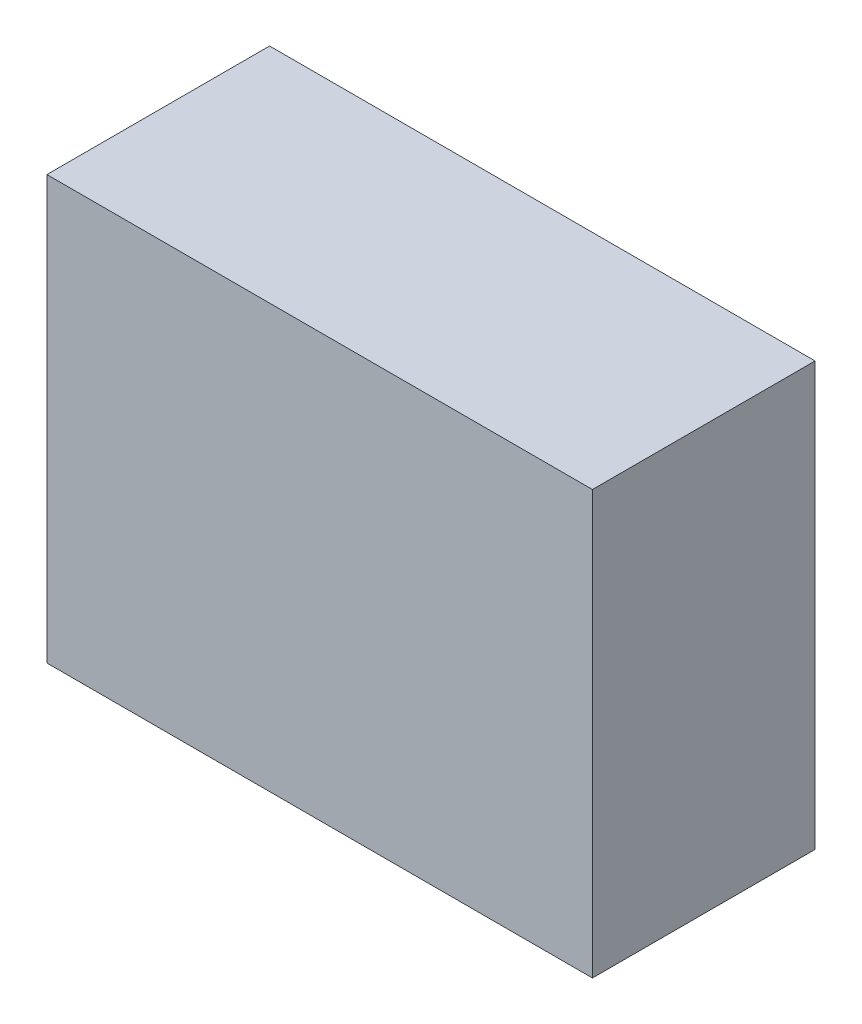
ISO-10303-21;
HEADER;
FILE_DESCRIPTION(('STEP AP214'),'2;1');
FILE_NAME('part.step','',(''),(''),'','','');
FILE_SCHEMA(('AUTOMOTIVE_DESIGN { 1 0 10303 214 1 1 1 1 }'));
ENDSEC;
DATA;
#1=APPLICATION_CONTEXT('core data for automotive mechanical design processes');
#2=APPLICATION_PROTOCOL_DEFINITION('international standard','automotive_design',2000,#1);
#3=PRODUCT_CONTEXT('',#1,'mechanical');
#4=PRODUCT('Part','Part','',(#3));
#5=PRODUCT_RELATED_PRODUCT_CATEGORY('part','',(#4));
#6=PRODUCT_DEFINITION_FORMATION('','',#4);
#7=PRODUCT_DEFINITION_CONTEXT('part definition',#1,'design');
#8=PRODUCT_DEFINITION('design','',#6,#7);
#9=PRODUCT_DEFINITION_SHAPE('','',#8);
#10=(LENGTH_UNIT() NAMED_UNIT(*) SI_UNIT(.MILLI.,.METRE.));
#11=(NAMED_UNIT(*) PLANE_ANGLE_UNIT() SI_UNIT($,.RADIAN.));
#12=(NAMED_UNIT(*) SI_UNIT($,.STERADIAN.) SOLID_ANGLE_UNIT());
#13=UNCERTAINTY_MEASURE_WITH_UNIT(LENGTH_MEASURE(1.E-05),#10,'distance_accuracy_value','');
#14=(GEOMETRIC_REPRESENTATION_CONTEXT(3) GLOBAL_UNCERTAINTY_ASSIGNED_CONTEXT((#13)) GLOBAL_UNIT_ASSIGNED_CONTEXT((#10,
#11,#12)) REPRESENTATION_CONTEXT('',''));
#15=CARTESIAN_POINT('',(0.,0.,0.));
#16=DIRECTION('',(0.,0.,1.));
#17=DIRECTION('',(1.,0.,0.));
#18=AXIS2_PLACEMENT_3D('',#15,#16,#17);
#19=CARTESIAN_POINT('',(-49.,38.,40.));
#20=DIRECTION('',(0.,-1.,0.));
#21=DIRECTION('',(1.,0.,0.));
#22=AXIS2_PLACEMENT_3D('',#19,#20,#21);
#23=PLANE('',#22);
#24=DIRECTION('',(-1.,0.,0.));
#25=VECTOR('',#24,1.);
#26=CARTESIAN_POINT('',(-49.,38.,0.));
#27=LINE('',#26,#25);
#28=CARTESIAN_POINT('',(49.,38.,0.));
#29=VERTEX_POINT('',#28);
#30=CARTESIAN_POINT('',(-49.,38.,0.));
#31=VERTEX_POINT('',#30);
#32=EDGE_CURVE('E105',#29,#31,#27,.T.);
#33=ORIENTED_EDGE('',*,*,#32,.T.);
#34=DIRECTION('',(0.,0.,-1.));
#35=VECTOR('',#34,1.);
#36=CARTESIAN_POINT('',(-49.,38.,40.));
#37=LINE('',#36,#35);
#38=CARTESIAN_POINT('',(-49.,38.,40.));
#39=VERTEX_POINT('',#38);
#40=EDGE_CURVE('E11',#39,#31,#37,.T.);
#41=ORIENTED_EDGE('',*,*,#40,.F.);
#42=DIRECTION('',(-1.,0.,0.));
#43=VECTOR('',#42,1.);
#44=CARTESIAN_POINT('',(-49.,38.,40.));
#45=LINE('',#44,#43);
#46=CARTESIAN_POINT('',(49.,38.,40.));
#47=VERTEX_POINT('',#46);
#48=EDGE_CURVE('E89',#47,#39,#45,.T.);
#49=ORIENTED_EDGE('',*,*,#48,.F.);
#50=DIRECTION('',(0.,0.,-1.));
#51=VECTOR('',#50,1.);
#52=CARTESIAN_POINT('',(49.,38.,40.));
#53=LINE('',#52,#51);
#54=EDGE_CURVE('E97',#47,#29,#53,.T.);
#55=ORIENTED_EDGE('',*,*,#54,.T.);
#56=EDGE_LOOP('',(#33,#41,#49,#55));
#57=FACE_BOUND('',#56,.T.);
#58=ADVANCED_FACE('F39',(#57),#23,.F.);
#59=CARTESIAN_POINT('',(-49.,-38.,40.));
#60=DIRECTION('',(1.,0.,0.));
#61=DIRECTION('',(0.,0.,-1.));
#62=AXIS2_PLACEMENT_3D('',#59,#60,#61);
#63=PLANE('',#62);
#64=DIRECTION('',(0.,-1.,0.));
#65=VECTOR('',#64,1.);
#66=CARTESIAN_POINT('',(-49.,-38.,0.));
#67=LINE('',#66,#65);
#68=CARTESIAN_POINT('',(-49.,-38.,0.));
#69=VERTEX_POINT('',#68);
#70=EDGE_CURVE('E92',#31,#69,#67,.T.);
#71=ORIENTED_EDGE('',*,*,#70,.T.);
#72=DIRECTION('',(0.,0.,-1.));
#73=VECTOR('',#72,1.);
#74=CARTESIAN_POINT('',(-49.,-38.,40.));
#75=LINE('',#74,#73);
#76=CARTESIAN_POINT('',(-49.,-38.,40.));
#77=VERTEX_POINT('',#76);
#78=EDGE_CURVE('E50',#77,#69,#75,.T.);
#79=ORIENTED_EDGE('',*,*,#78,.F.);
#80=DIRECTION('',(0.,-1.,0.));
#81=VECTOR('',#80,1.);
#82=CARTESIAN_POINT('',(-49.,-38.,40.));
#83=LINE('',#82,#81);
#84=EDGE_CURVE('E82',#39,#77,#83,.T.);
#85=ORIENTED_EDGE('',*,*,#84,.F.);
#86=ORIENTED_EDGE('',*,*,#40,.T.);
#87=EDGE_LOOP('',(#71,#79,#85,#86));
#88=FACE_BOUND('',#87,.T.);
#89=ADVANCED_FACE('F93',(#88),#63,.F.);
#90=CARTESIAN_POINT('',(-49.,-38.,40.));
#91=DIRECTION('',(0.,1.,0.));
#92=DIRECTION('',(-1.,0.,0.));
#93=AXIS2_PLACEMENT_3D('',#90,#91,#92);
#94=PLANE('',#93);
#95=DIRECTION('',(1.,0.,0.));
#96=VECTOR('',#95,1.);
#97=CARTESIAN_POINT('',(-49.,-38.,0.));
#98=LINE('',#97,#96);
#99=CARTESIAN_POINT('',(49.,-38.,0.));
#100=VERTEX_POINT('',#99);
#101=EDGE_CURVE('E72',#69,#100,#98,.T.);
#102=ORIENTED_EDGE('',*,*,#101,.T.);
#103=DIRECTION('',(0.,0.,-1.));
#104=VECTOR('',#103,1.);
#105=CARTESIAN_POINT('',(49.,-38.,40.));
#106=LINE('',#105,#104);
#107=CARTESIAN_POINT('',(49.,-38.,40.));
#108=VERTEX_POINT('',#107);
#109=EDGE_CURVE('E94',#108,#100,#106,.T.);
#110=ORIENTED_EDGE('',*,*,#109,.F.);
#111=DIRECTION('',(1.,0.,0.));
#112=VECTOR('',#111,1.);
#113=CARTESIAN_POINT('',(-49.,-38.,40.));
#114=LINE('',#113,#112);
#115=EDGE_CURVE('E88',#77,#108,#114,.T.);
#116=ORIENTED_EDGE('',*,*,#115,.F.);
#117=ORIENTED_EDGE('',*,*,#78,.T.);
#118=EDGE_LOOP('',(#102,#110,#116,#117));
#119=FACE_BOUND('',#118,.T.);
#120=ADVANCED_FACE('F96',(#119),#94,.F.);
#121=CARTESIAN_POINT('',(49.,-38.,40.));
#122=DIRECTION('',(-1.,0.,0.));
#123=DIRECTION('',(0.,0.,1.));
#124=AXIS2_PLACEMENT_3D('',#121,#122,#123);
#125=PLANE('',#124);
#126=DIRECTION('',(0.,1.,0.));
#127=VECTOR('',#126,1.);
#128=CARTESIAN_POINT('',(49.,-38.,0.));
#129=LINE('',#128,#127);
#130=EDGE_CURVE('E76',#100,#29,#129,.T.);
#131=ORIENTED_EDGE('',*,*,#130,.T.);
#132=ORIENTED_EDGE('',*,*,#54,.F.);
#133=DIRECTION('',(0.,1.,0.));
#134=VECTOR('',#133,1.);
#135=CARTESIAN_POINT('',(49.,-38.,40.));
#136=LINE('',#135,#134);
#137=EDGE_CURVE('E54',#108,#47,#136,.T.);
#138=ORIENTED_EDGE('',*,*,#137,.F.);
#139=ORIENTED_EDGE('',*,*,#109,.T.);
#140=EDGE_LOOP('',(#131,#132,#138,#139));
#141=FACE_BOUND('',#140,.T.);
#142=ADVANCED_FACE('F108',(#141),#125,.F.);
#143=CARTESIAN_POINT('',(0.,0.,40.));
#144=DIRECTION('',(0.,0.,1.));
#145=DIRECTION('',(1.,0.,0.));
#146=AXIS2_PLACEMENT_3D('',#143,#144,#145);
#147=PLANE('',#146);
#148=ORIENTED_EDGE('',*,*,#48,.T.);
#149=ORIENTED_EDGE('',*,*,#84,.T.);
#150=ORIENTED_EDGE('',*,*,#115,.T.);
#151=ORIENTED_EDGE('',*,*,#137,.T.);
#152=EDGE_LOOP('',(#148,#149,#150,#151));
#153=FACE_BOUND('',#152,.T.);
#154=ADVANCED_FACE('F86',(#153),#147,.T.);
#155=CARTESIAN_POINT('',(0.,0.,0.));
#156=DIRECTION('',(0.,0.,1.));
#157=DIRECTION('',(1.,0.,0.));
#158=AXIS2_PLACEMENT_3D('',#155,#156,#157);
#159=PLANE('',#158);
#160=ORIENTED_EDGE('',*,*,#32,.F.);
#161=ORIENTED_EDGE('',*,*,#130,.F.);
#162=ORIENTED_EDGE('',*,*,#101,.F.);
#163=ORIENTED_EDGE('',*,*,#70,.F.);
#164=EDGE_LOOP('',(#160,#161,#162,#163));
#165=FACE_BOUND('',#164,.T.);
#166=ADVANCED_FACE('F115',(#165),#159,.F.);
#167=CLOSED_SHELL('',(#58,#89,#120,#142,#154,#166));
#168=MANIFOLD_SOLID_BREP('B2',#167);
#169=ADVANCED_BREP_SHAPE_REPRESENTATION('',(#18,#168),#14);
#170=SHAPE_DEFINITION_REPRESENTATION(#9,#169);
ENDSEC;
END-ISO-10303-21;
